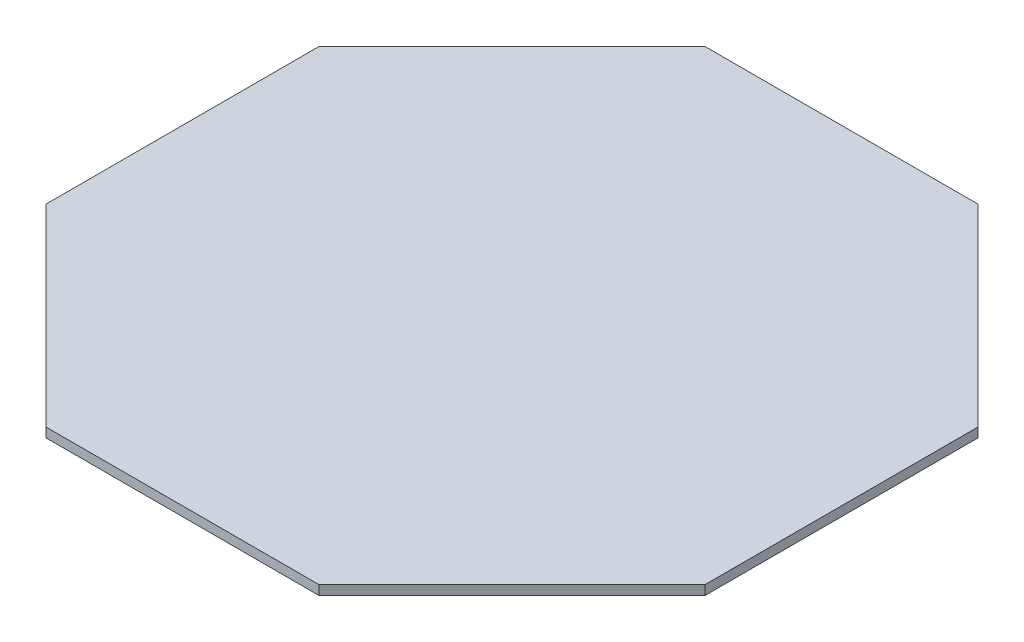
ISO-10303-21;
HEADER;
FILE_DESCRIPTION(('STEP AP214'),'2;1');
FILE_NAME('part.step','',(''),(''),'','','');
FILE_SCHEMA(('AUTOMOTIVE_DESIGN { 1 0 10303 214 1 1 1 1 }'));
ENDSEC;
DATA;
#1=APPLICATION_CONTEXT('core data for automotive mechanical design processes');
#2=APPLICATION_PROTOCOL_DEFINITION('international standard','automotive_design',2000,#1);
#3=PRODUCT_CONTEXT('',#1,'mechanical');
#4=PRODUCT('Part','Part','',(#3));
#5=PRODUCT_RELATED_PRODUCT_CATEGORY('part','',(#4));
#6=PRODUCT_DEFINITION_FORMATION('','',#4);
#7=PRODUCT_DEFINITION_CONTEXT('part definition',#1,'design');
#8=PRODUCT_DEFINITION('design','',#6,#7);
#9=PRODUCT_DEFINITION_SHAPE('','',#8);
#10=(LENGTH_UNIT() NAMED_UNIT(*) SI_UNIT(.MILLI.,.METRE.));
#11=(NAMED_UNIT(*) PLANE_ANGLE_UNIT() SI_UNIT($,.RADIAN.));
#12=(NAMED_UNIT(*) SI_UNIT($,.STERADIAN.) SOLID_ANGLE_UNIT());
#13=UNCERTAINTY_MEASURE_WITH_UNIT(LENGTH_MEASURE(1.E-05),#10,'distance_accuracy_value','');
#14=(GEOMETRIC_REPRESENTATION_CONTEXT(3) GLOBAL_UNCERTAINTY_ASSIGNED_CONTEXT((#13)) GLOBAL_UNIT_ASSIGNED_CONTEXT((#10,
#11,#12)) REPRESENTATION_CONTEXT('',''));
#15=CARTESIAN_POINT('',(0.,0.,0.));
#16=DIRECTION('',(0.,0.,1.));
#17=DIRECTION('',(1.,0.,0.));
#18=AXIS2_PLACEMENT_3D('',#15,#16,#17);
#19=CARTESIAN_POINT('',(105.018289963229,3.,0.));
#20=DIRECTION('',(-1.,0.,0.));
#21=DIRECTION('',(0.,0.,1.));
#22=AXIS2_PLACEMENT_3D('',#19,#20,#21);
#23=PLANE('',#22);
#24=DIRECTION('',(0.,0.,-1.));
#25=VECTOR('',#24,1.);
#26=CARTESIAN_POINT('',(105.018289963229,0.,0.));
#27=LINE('',#26,#25);
#28=CARTESIAN_POINT('',(105.018289963229,0.,43.5));
#29=VERTEX_POINT('',#28);
#30=CARTESIAN_POINT('',(105.018289963229,0.,-43.5));
#31=VERTEX_POINT('',#30);
#32=EDGE_CURVE('E187',#29,#31,#27,.T.);
#33=ORIENTED_EDGE('',*,*,#32,.T.);
#34=DIRECTION('',(0.,-1.,0.));
#35=VECTOR('',#34,1.);
#36=CARTESIAN_POINT('',(105.018289963229,3.,-43.5));
#37=LINE('',#36,#35);
#38=CARTESIAN_POINT('',(105.018289963229,3.,-43.5));
#39=VERTEX_POINT('',#38);
#40=EDGE_CURVE('E11',#39,#31,#37,.T.);
#41=ORIENTED_EDGE('',*,*,#40,.F.);
#42=DIRECTION('',(0.,0.,-1.));
#43=VECTOR('',#42,1.);
#44=CARTESIAN_POINT('',(105.018289963229,3.,0.));
#45=LINE('',#44,#43);
#46=CARTESIAN_POINT('',(105.018289963229,3.,43.5));
#47=VERTEX_POINT('',#46);
#48=EDGE_CURVE('E54',#47,#39,#45,.T.);
#49=ORIENTED_EDGE('',*,*,#48,.F.);
#50=DIRECTION('',(0.,-1.,0.));
#51=VECTOR('',#50,1.);
#52=CARTESIAN_POINT('',(105.018289963229,3.,43.5));
#53=LINE('',#52,#51);
#54=EDGE_CURVE('E180',#47,#29,#53,.T.);
#55=ORIENTED_EDGE('',*,*,#54,.T.);
#56=EDGE_LOOP('',(#33,#41,#49,#55));
#57=FACE_BOUND('',#56,.T.);
#58=ADVANCED_FACE('F39',(#57),#23,.F.);
#59=CARTESIAN_POINT('',(74.2591449816146,3.,-74.2591449816148));
#60=DIRECTION('',(-0.707106781186547,0.,0.707106781186548));
#61=DIRECTION('',(0.707106781186548,0.,0.707106781186547));
#62=AXIS2_PLACEMENT_3D('',#59,#60,#61);
#63=PLANE('',#62);
#64=DIRECTION('',(-0.707106781186548,0.,-0.707106781186547));
#65=VECTOR('',#64,1.);
#66=CARTESIAN_POINT('',(74.2591449816146,0.,-74.2591449816148));
#67=LINE('',#66,#65);
#68=CARTESIAN_POINT('',(43.5000000000011,0.,-105.018289963229));
#69=VERTEX_POINT('',#68);
#70=EDGE_CURVE('E120',#31,#69,#67,.T.);
#71=ORIENTED_EDGE('',*,*,#70,.T.);
#72=DIRECTION('',(0.,-1.,0.));
#73=VECTOR('',#72,1.);
#74=CARTESIAN_POINT('',(43.5000000000011,3.,-105.018289963229));
#75=LINE('',#74,#73);
#76=CARTESIAN_POINT('',(43.5000000000011,3.,-105.018289963229));
#77=VERTEX_POINT('',#76);
#78=EDGE_CURVE('E112',#77,#69,#75,.T.);
#79=ORIENTED_EDGE('',*,*,#78,.F.);
#80=DIRECTION('',(-0.707106781186548,0.,-0.707106781186547));
#81=VECTOR('',#80,1.);
#82=CARTESIAN_POINT('',(74.2591449816146,3.,-74.2591449816148));
#83=LINE('',#82,#81);
#84=EDGE_CURVE('E48',#39,#77,#83,.T.);
#85=ORIENTED_EDGE('',*,*,#84,.F.);
#86=ORIENTED_EDGE('',*,*,#40,.T.);
#87=EDGE_LOOP('',(#71,#79,#85,#86));
#88=FACE_BOUND('',#87,.T.);
#89=ADVANCED_FACE('F118',(#88),#63,.F.);
#90=CARTESIAN_POINT('',(0.,3.,0.));
#91=DIRECTION('',(0.,-1.,0.));
#92=DIRECTION('',(0.,0.,-1.));
#93=AXIS2_PLACEMENT_3D('',#90,#91,#92);
#94=PLANE('',#93);
#95=DIRECTION('',(0.707106781186549,0.,-0.707106781186547));
#96=VECTOR('',#95,1.);
#97=CARTESIAN_POINT('',(74.2591449816146,3.,74.2591449816148));
#98=LINE('',#97,#96);
#99=CARTESIAN_POINT('',(43.4999999999996,3.,105.01828996323));
#100=VERTEX_POINT('',#99);
#101=EDGE_CURVE('E177',#100,#47,#98,.T.);
#102=ORIENTED_EDGE('',*,*,#101,.T.);
#103=ORIENTED_EDGE('',*,*,#48,.T.);
#104=ORIENTED_EDGE('',*,*,#84,.T.);
#105=DIRECTION('',(-1.,0.,0.));
#106=VECTOR('',#105,1.);
#107=CARTESIAN_POINT('',(1.1000081989315E-12,3.,-105.018289963229));
#108=LINE('',#107,#106);
#109=CARTESIAN_POINT('',(-43.4999999999989,3.,-105.01828996323));
#110=VERTEX_POINT('',#109);
#111=EDGE_CURVE('E102',#77,#110,#108,.T.);
#112=ORIENTED_EDGE('',*,*,#111,.T.);
#113=DIRECTION('',(-0.707106781186553,0.,0.707106781186542));
#114=VECTOR('',#113,1.);
#115=CARTESIAN_POINT('',(-74.259144981614,3.,-74.2591449816153));
#116=LINE('',#115,#114);
#117=CARTESIAN_POINT('',(-105.018289963229,3.,-43.5000000000008));
#118=VERTEX_POINT('',#117);
#119=EDGE_CURVE('E130',#110,#118,#116,.T.);
#120=ORIENTED_EDGE('',*,*,#119,.T.);
#121=DIRECTION('',(0.,0.,1.));
#122=VECTOR('',#121,1.);
#123=CARTESIAN_POINT('',(-105.018289963229,3.,0.));
#124=LINE('',#123,#122);
#125=CARTESIAN_POINT('',(-105.018289963229,3.,43.5));
#126=VERTEX_POINT('',#125);
#127=EDGE_CURVE('E141',#118,#126,#124,.T.);
#128=ORIENTED_EDGE('',*,*,#127,.T.);
#129=DIRECTION('',(0.707106781186544,0.,0.707106781186551));
#130=VECTOR('',#129,1.);
#131=CARTESIAN_POINT('',(-74.2591449816151,3.,74.2591449816143));
#132=LINE('',#131,#130);
#133=CARTESIAN_POINT('',(-43.5000000000004,3.,105.018289963229));
#134=VERTEX_POINT('',#133);
#135=EDGE_CURVE('E153',#126,#134,#132,.T.);
#136=ORIENTED_EDGE('',*,*,#135,.T.);
#137=DIRECTION('',(1.,0.,0.));
#138=VECTOR('',#137,1.);
#139=CARTESIAN_POINT('',(-3.66669399643833E-13,3.,105.018289963229));
#140=LINE('',#139,#138);
#141=EDGE_CURVE('E165',#134,#100,#140,.T.);
#142=ORIENTED_EDGE('',*,*,#141,.T.);
#143=EDGE_LOOP('',(#102,#103,#104,#112,#120,#128,#136,#142));
#144=FACE_BOUND('',#143,.T.);
#145=ADVANCED_FACE('F100',(#144),#94,.F.);
#146=CARTESIAN_POINT('',(0.,0.,0.));
#147=DIRECTION('',(0.,-1.,0.));
#148=DIRECTION('',(0.,0.,-1.));
#149=AXIS2_PLACEMENT_3D('',#146,#147,#148);
#150=PLANE('',#149);
#151=ORIENTED_EDGE('',*,*,#32,.F.);
#152=DIRECTION('',(0.707106781186549,0.,-0.707106781186547));
#153=VECTOR('',#152,1.);
#154=CARTESIAN_POINT('',(74.2591449816146,0.,74.2591449816148));
#155=LINE('',#154,#153);
#156=CARTESIAN_POINT('',(43.4999999999996,0.,105.01828996323));
#157=VERTEX_POINT('',#156);
#158=EDGE_CURVE('E176',#157,#29,#155,.T.);
#159=ORIENTED_EDGE('',*,*,#158,.F.);
#160=DIRECTION('',(1.,0.,0.));
#161=VECTOR('',#160,1.);
#162=CARTESIAN_POINT('',(-3.66669399643833E-13,0.,105.018289963229));
#163=LINE('',#162,#161);
#164=CARTESIAN_POINT('',(-43.5000000000004,0.,105.018289963229));
#165=VERTEX_POINT('',#164);
#166=EDGE_CURVE('E164',#165,#157,#163,.T.);
#167=ORIENTED_EDGE('',*,*,#166,.F.);
#168=DIRECTION('',(0.707106781186544,0.,0.707106781186551));
#169=VECTOR('',#168,1.);
#170=CARTESIAN_POINT('',(-74.2591449816151,0.,74.2591449816143));
#171=LINE('',#170,#169);
#172=CARTESIAN_POINT('',(-105.018289963229,0.,43.5));
#173=VERTEX_POINT('',#172);
#174=EDGE_CURVE('E152',#173,#165,#171,.T.);
#175=ORIENTED_EDGE('',*,*,#174,.F.);
#176=DIRECTION('',(0.,0.,1.));
#177=VECTOR('',#176,1.);
#178=CARTESIAN_POINT('',(-105.018289963229,0.,0.));
#179=LINE('',#178,#177);
#180=CARTESIAN_POINT('',(-105.018289963229,0.,-43.5000000000008));
#181=VERTEX_POINT('',#180);
#182=EDGE_CURVE('E140',#181,#173,#179,.T.);
#183=ORIENTED_EDGE('',*,*,#182,.F.);
#184=DIRECTION('',(-0.707106781186553,0.,0.707106781186542));
#185=VECTOR('',#184,1.);
#186=CARTESIAN_POINT('',(-74.259144981614,0.,-74.2591449816153));
#187=LINE('',#186,#185);
#188=CARTESIAN_POINT('',(-43.4999999999989,0.,-105.01828996323));
#189=VERTEX_POINT('',#188);
#190=EDGE_CURVE('E129',#189,#181,#187,.T.);
#191=ORIENTED_EDGE('',*,*,#190,.F.);
#192=DIRECTION('',(-1.,0.,0.));
#193=VECTOR('',#192,1.);
#194=CARTESIAN_POINT('',(1.1000081989315E-12,0.,-105.018289963229));
#195=LINE('',#194,#193);
#196=EDGE_CURVE('E116',#69,#189,#195,.T.);
#197=ORIENTED_EDGE('',*,*,#196,.F.);
#198=ORIENTED_EDGE('',*,*,#70,.F.);
#199=EDGE_LOOP('',(#151,#159,#167,#175,#183,#191,#197,#198));
#200=FACE_BOUND('',#199,.T.);
#201=ADVANCED_FACE('F195',(#200),#150,.T.);
#202=CARTESIAN_POINT('',(74.2591449816146,3.,74.2591449816148));
#203=DIRECTION('',(-0.707106781186546,0.,-0.707106781186548));
#204=DIRECTION('',(-0.707106781186549,0.,0.707106781186547));
#205=AXIS2_PLACEMENT_3D('',#202,#203,#204);
#206=PLANE('',#205);
#207=ORIENTED_EDGE('',*,*,#158,.T.);
#208=ORIENTED_EDGE('',*,*,#54,.F.);
#209=ORIENTED_EDGE('',*,*,#101,.F.);
#210=DIRECTION('',(0.,-1.,0.));
#211=VECTOR('',#210,1.);
#212=CARTESIAN_POINT('',(43.4999999999996,3.,105.01828996323));
#213=LINE('',#212,#211);
#214=EDGE_CURVE('E169',#100,#157,#213,.T.);
#215=ORIENTED_EDGE('',*,*,#214,.T.);
#216=EDGE_LOOP('',(#207,#208,#209,#215));
#217=FACE_BOUND('',#216,.T.);
#218=ADVANCED_FACE('F209',(#217),#206,.F.);
#219=CARTESIAN_POINT('',(-3.66669399643833E-13,3.,105.018289963229));
#220=DIRECTION('',(0.,0.,-1.));
#221=DIRECTION('',(-1.,0.,0.));
#222=AXIS2_PLACEMENT_3D('',#219,#220,#221);
#223=PLANE('',#222);
#224=ORIENTED_EDGE('',*,*,#166,.T.);
#225=ORIENTED_EDGE('',*,*,#214,.F.);
#226=ORIENTED_EDGE('',*,*,#141,.F.);
#227=DIRECTION('',(0.,-1.,0.));
#228=VECTOR('',#227,1.);
#229=CARTESIAN_POINT('',(-43.5000000000004,3.,105.018289963229));
#230=LINE('',#229,#228);
#231=EDGE_CURVE('E157',#134,#165,#230,.T.);
#232=ORIENTED_EDGE('',*,*,#231,.T.);
#233=EDGE_LOOP('',(#224,#225,#226,#232));
#234=FACE_BOUND('',#233,.T.);
#235=ADVANCED_FACE('F206',(#234),#223,.F.);
#236=CARTESIAN_POINT('',(-74.2591449816151,3.,74.2591449816143));
#237=DIRECTION('',(0.707106781186551,0.,-0.707106781186544));
#238=DIRECTION('',(-0.707106781186544,0.,-0.707106781186551));
#239=AXIS2_PLACEMENT_3D('',#236,#237,#238);
#240=PLANE('',#239);
#241=ORIENTED_EDGE('',*,*,#174,.T.);
#242=ORIENTED_EDGE('',*,*,#231,.F.);
#243=ORIENTED_EDGE('',*,*,#135,.F.);
#244=DIRECTION('',(0.,-1.,0.));
#245=VECTOR('',#244,1.);
#246=CARTESIAN_POINT('',(-105.018289963229,3.,43.5));
#247=LINE('',#246,#245);
#248=EDGE_CURVE('E145',#126,#173,#247,.T.);
#249=ORIENTED_EDGE('',*,*,#248,.T.);
#250=EDGE_LOOP('',(#241,#242,#243,#249));
#251=FACE_BOUND('',#250,.T.);
#252=ADVANCED_FACE('F204',(#251),#240,.F.);
#253=CARTESIAN_POINT('',(-105.018289963229,3.,0.));
#254=DIRECTION('',(1.,0.,0.));
#255=DIRECTION('',(0.,0.,-1.));
#256=AXIS2_PLACEMENT_3D('',#253,#254,#255);
#257=PLANE('',#256);
#258=ORIENTED_EDGE('',*,*,#182,.T.);
#259=ORIENTED_EDGE('',*,*,#248,.F.);
#260=ORIENTED_EDGE('',*,*,#127,.F.);
#261=DIRECTION('',(0.,-1.,0.));
#262=VECTOR('',#261,1.);
#263=CARTESIAN_POINT('',(-105.018289963229,3.,-43.5000000000008));
#264=LINE('',#263,#262);
#265=EDGE_CURVE('E133',#118,#181,#264,.T.);
#266=ORIENTED_EDGE('',*,*,#265,.T.);
#267=EDGE_LOOP('',(#258,#259,#260,#266));
#268=FACE_BOUND('',#267,.T.);
#269=ADVANCED_FACE('F202',(#268),#257,.F.);
#270=CARTESIAN_POINT('',(-74.259144981614,3.,-74.2591449816153));
#271=DIRECTION('',(0.707106781186542,0.,0.707106781186553));
#272=DIRECTION('',(0.707106781186553,0.,-0.707106781186542));
#273=AXIS2_PLACEMENT_3D('',#270,#271,#272);
#274=PLANE('',#273);
#275=ORIENTED_EDGE('',*,*,#190,.T.);
#276=ORIENTED_EDGE('',*,*,#265,.F.);
#277=ORIENTED_EDGE('',*,*,#119,.F.);
#278=DIRECTION('',(0.,-1.,0.));
#279=VECTOR('',#278,1.);
#280=CARTESIAN_POINT('',(-43.4999999999989,3.,-105.01828996323));
#281=LINE('',#280,#279);
#282=EDGE_CURVE('E114',#110,#189,#281,.T.);
#283=ORIENTED_EDGE('',*,*,#282,.T.);
#284=EDGE_LOOP('',(#275,#276,#277,#283));
#285=FACE_BOUND('',#284,.T.);
#286=ADVANCED_FACE('F197',(#285),#274,.F.);
#287=CARTESIAN_POINT('',(1.1000081989315E-12,3.,-105.018289963229));
#288=DIRECTION('',(0.,0.,1.));
#289=DIRECTION('',(1.,0.,0.));
#290=AXIS2_PLACEMENT_3D('',#287,#288,#289);
#291=PLANE('',#290);
#292=ORIENTED_EDGE('',*,*,#196,.T.);
#293=ORIENTED_EDGE('',*,*,#282,.F.);
#294=ORIENTED_EDGE('',*,*,#111,.F.);
#295=ORIENTED_EDGE('',*,*,#78,.T.);
#296=EDGE_LOOP('',(#292,#293,#294,#295));
#297=FACE_BOUND('',#296,.T.);
#298=ADVANCED_FACE('F111',(#297),#291,.F.);
#299=CLOSED_SHELL('',(#58,#89,#145,#201,#218,#235,#252,#269,#286,#298));
#300=MANIFOLD_SOLID_BREP('B2',#299);
#301=ADVANCED_BREP_SHAPE_REPRESENTATION('',(#18,#300),#14);
#302=SHAPE_DEFINITION_REPRESENTATION(#9,#301);
ENDSEC;
END-ISO-10303-21;
